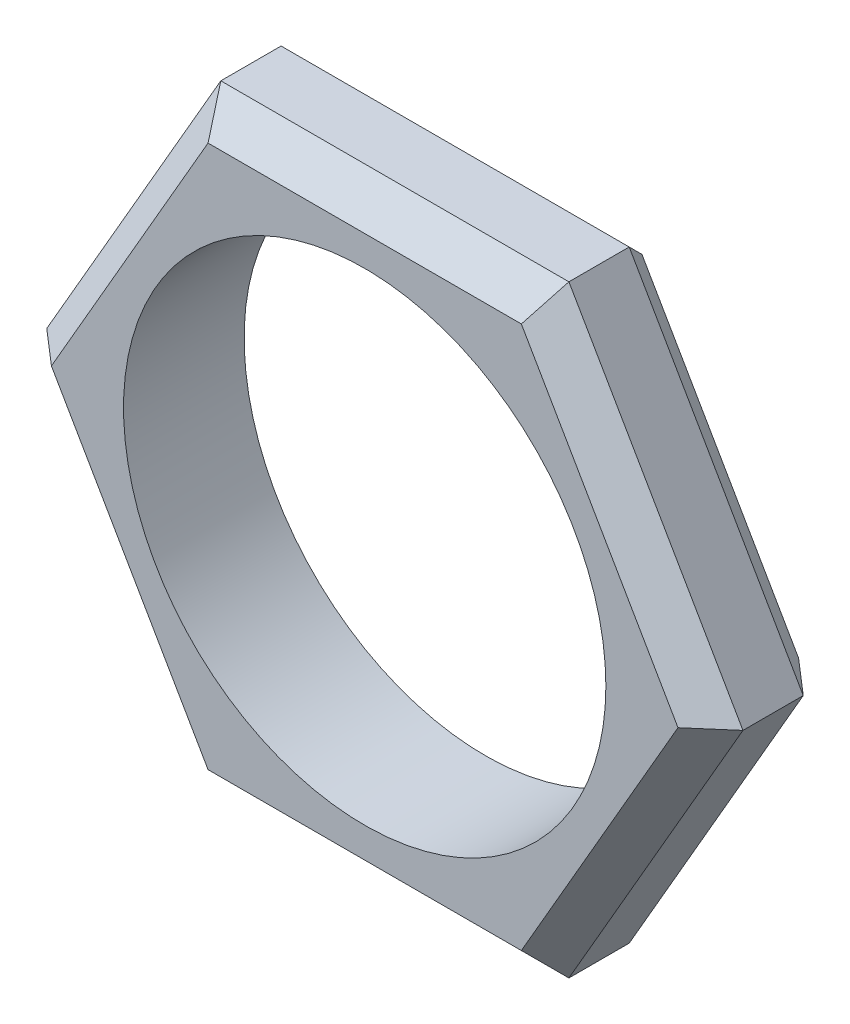
ISO-10303-21;
HEADER;
FILE_DESCRIPTION(('STEP AP214'),'2;1');
FILE_NAME('part.step','',(''),(''),'','','');
FILE_SCHEMA(('AUTOMOTIVE_DESIGN { 1 0 10303 214 1 1 1 1 }'));
ENDSEC;
DATA;
#1=APPLICATION_CONTEXT('core data for automotive mechanical design processes');
#2=APPLICATION_PROTOCOL_DEFINITION('international standard','automotive_design',2000,#1);
#3=PRODUCT_CONTEXT('',#1,'mechanical');
#4=PRODUCT('Part','Part','',(#3));
#5=PRODUCT_RELATED_PRODUCT_CATEGORY('part','',(#4));
#6=PRODUCT_DEFINITION_FORMATION('','',#4);
#7=PRODUCT_DEFINITION_CONTEXT('part definition',#1,'design');
#8=PRODUCT_DEFINITION('design','',#6,#7);
#9=PRODUCT_DEFINITION_SHAPE('','',#8);
#10=(LENGTH_UNIT() NAMED_UNIT(*) SI_UNIT(.MILLI.,.METRE.));
#11=(NAMED_UNIT(*) PLANE_ANGLE_UNIT() SI_UNIT($,.RADIAN.));
#12=(NAMED_UNIT(*) SI_UNIT($,.STERADIAN.) SOLID_ANGLE_UNIT());
#13=UNCERTAINTY_MEASURE_WITH_UNIT(LENGTH_MEASURE(1.E-05),#10,'distance_accuracy_value','');
#14=(GEOMETRIC_REPRESENTATION_CONTEXT(3) GLOBAL_UNCERTAINTY_ASSIGNED_CONTEXT((#13)) GLOBAL_UNIT_ASSIGNED_CONTEXT((#10,
#11,#12)) REPRESENTATION_CONTEXT('',''));
#15=CARTESIAN_POINT('',(0.,0.,0.));
#16=DIRECTION('',(0.,0.,1.));
#17=DIRECTION('',(1.,0.,0.));
#18=AXIS2_PLACEMENT_3D('',#15,#16,#17);
#19=CARTESIAN_POINT('',(0.,0.,2.));
#20=DIRECTION('',(0.,0.,1.));
#21=DIRECTION('',(1.,0.,0.));
#22=AXIS2_PLACEMENT_3D('',#19,#20,#21);
#23=PLANE('',#22);
#24=DIRECTION('',(-0.5,-0.866025403784439,0.));
#25=VECTOR('',#24,1.);
#26=CARTESIAN_POINT('',(-5.34048999000404,-0.250000000000001,2.));
#27=LINE('',#26,#25);
#28=CARTESIAN_POINT('',(-2.59807621135332,4.5,2.));
#29=VERTEX_POINT('',#28);
#30=CARTESIAN_POINT('',(-5.19615242270663,0.,2.));
#31=VERTEX_POINT('',#30);
#32=EDGE_CURVE('E191',#29,#31,#27,.T.);
#33=ORIENTED_EDGE('',*,*,#32,.T.);
#34=DIRECTION('',(0.5,-0.866025403784439,0.));
#35=VECTOR('',#34,1.);
#36=CARTESIAN_POINT('',(-2.45373864405591,-4.75,2.));
#37=LINE('',#36,#35);
#38=CARTESIAN_POINT('',(-2.59807621135331,-4.5,2.));
#39=VERTEX_POINT('',#38);
#40=EDGE_CURVE('E11',#31,#39,#37,.T.);
#41=ORIENTED_EDGE('',*,*,#40,.T.);
#42=DIRECTION('',(1.,0.,0.));
#43=VECTOR('',#42,1.);
#44=CARTESIAN_POINT('',(2.88675134594813,-4.5,2.));
#45=LINE('',#44,#43);
#46=CARTESIAN_POINT('',(2.59807621135332,-4.5,2.));
#47=VERTEX_POINT('',#46);
#48=EDGE_CURVE('E41',#39,#47,#45,.T.);
#49=ORIENTED_EDGE('',*,*,#48,.T.);
#50=DIRECTION('',(0.5,0.866025403784439,0.));
#51=VECTOR('',#50,1.);
#52=CARTESIAN_POINT('',(5.34048999000404,0.25,2.));
#53=LINE('',#52,#51);
#54=CARTESIAN_POINT('',(5.19615242270663,0.,2.));
#55=VERTEX_POINT('',#54);
#56=EDGE_CURVE('E186',#47,#55,#53,.T.);
#57=ORIENTED_EDGE('',*,*,#56,.T.);
#58=DIRECTION('',(-0.5,0.866025403784439,0.));
#59=VECTOR('',#58,1.);
#60=CARTESIAN_POINT('',(2.45373864405591,4.75,2.));
#61=LINE('',#60,#59);
#62=CARTESIAN_POINT('',(2.59807621135332,4.5,2.));
#63=VERTEX_POINT('',#62);
#64=EDGE_CURVE('E188',#55,#63,#61,.T.);
#65=ORIENTED_EDGE('',*,*,#64,.T.);
#66=DIRECTION('',(-1.,0.,0.));
#67=VECTOR('',#66,1.);
#68=CARTESIAN_POINT('',(-2.88675134594813,4.5,2.));
#69=LINE('',#68,#67);
#70=EDGE_CURVE('E157',#63,#29,#69,.T.);
#71=ORIENTED_EDGE('',*,*,#70,.T.);
#72=EDGE_LOOP('',(#33,#41,#49,#57,#65,#71));
#73=FACE_BOUND('',#72,.T.);
#74=CARTESIAN_POINT('',(0.,0.,2.));
#75=DIRECTION('',(0.,0.,1.));
#76=DIRECTION('',(1.,0.,0.));
#77=AXIS2_PLACEMENT_3D('',#74,#75,#76);
#78=CIRCLE('',#77,4.);
#79=CARTESIAN_POINT('',(4.,0.,2.));
#80=VERTEX_POINT('',#79);
#81=EDGE_CURVE('E236',#80,#80,#78,.T.);
#82=ORIENTED_EDGE('',*,*,#81,.F.);
#83=EDGE_LOOP('',(#82));
#84=FACE_BOUND('',#83,.T.);
#85=ADVANCED_FACE('F32',(#73,#84),#23,.T.);
#86=CARTESIAN_POINT('',(0.,0.,0.));
#87=DIRECTION('',(0.,0.,1.));
#88=DIRECTION('',(1.,0.,0.));
#89=AXIS2_PLACEMENT_3D('',#86,#87,#88);
#90=PLANE('',#89);
#91=DIRECTION('',(1.,0.,0.));
#92=VECTOR('',#91,1.);
#93=CARTESIAN_POINT('',(0.,4.5,0.));
#94=LINE('',#93,#92);
#95=CARTESIAN_POINT('',(-2.59807621135332,4.5,0.));
#96=VERTEX_POINT('',#95);
#97=CARTESIAN_POINT('',(2.59807621135331,4.5,0.));
#98=VERTEX_POINT('',#97);
#99=EDGE_CURVE('E213',#96,#98,#94,.T.);
#100=ORIENTED_EDGE('',*,*,#99,.T.);
#101=DIRECTION('',(0.5,-0.866025403784439,0.));
#102=VECTOR('',#101,1.);
#103=CARTESIAN_POINT('',(3.89711431702997,2.25,0.));
#104=LINE('',#103,#102);
#105=CARTESIAN_POINT('',(5.19615242270663,0.,0.));
#106=VERTEX_POINT('',#105);
#107=EDGE_CURVE('E135',#98,#106,#104,.T.);
#108=ORIENTED_EDGE('',*,*,#107,.T.);
#109=DIRECTION('',(-0.5,-0.866025403784439,0.));
#110=VECTOR('',#109,1.);
#111=CARTESIAN_POINT('',(3.89711431702997,-2.25,0.));
#112=LINE('',#111,#110);
#113=CARTESIAN_POINT('',(2.59807621135332,-4.5,0.));
#114=VERTEX_POINT('',#113);
#115=EDGE_CURVE('E221',#106,#114,#112,.T.);
#116=ORIENTED_EDGE('',*,*,#115,.T.);
#117=DIRECTION('',(-1.,0.,0.));
#118=VECTOR('',#117,1.);
#119=CARTESIAN_POINT('',(0.,-4.5,0.));
#120=LINE('',#119,#118);
#121=CARTESIAN_POINT('',(-2.59807621135331,-4.5,0.));
#122=VERTEX_POINT('',#121);
#123=EDGE_CURVE('E219',#114,#122,#120,.T.);
#124=ORIENTED_EDGE('',*,*,#123,.T.);
#125=DIRECTION('',(-0.5,0.866025403784439,0.));
#126=VECTOR('',#125,1.);
#127=CARTESIAN_POINT('',(-3.89711431702997,-2.25,0.));
#128=LINE('',#127,#126);
#129=CARTESIAN_POINT('',(-5.19615242270663,0.,0.));
#130=VERTEX_POINT('',#129);
#131=EDGE_CURVE('E217',#122,#130,#128,.T.);
#132=ORIENTED_EDGE('',*,*,#131,.T.);
#133=DIRECTION('',(0.5,0.866025403784439,0.));
#134=VECTOR('',#133,1.);
#135=CARTESIAN_POINT('',(-3.89711431702997,2.25,0.));
#136=LINE('',#135,#134);
#137=EDGE_CURVE('E215',#130,#96,#136,.T.);
#138=ORIENTED_EDGE('',*,*,#137,.T.);
#139=EDGE_LOOP('',(#100,#108,#116,#124,#132,#138));
#140=FACE_BOUND('',#139,.T.);
#141=CARTESIAN_POINT('',(0.,0.,0.));
#142=DIRECTION('',(0.,0.,1.));
#143=DIRECTION('',(1.,0.,0.));
#144=AXIS2_PLACEMENT_3D('',#141,#142,#143);
#145=CIRCLE('',#144,4.);
#146=CARTESIAN_POINT('',(4.,0.,0.));
#147=VERTEX_POINT('',#146);
#148=EDGE_CURVE('E174',#147,#147,#145,.T.);
#149=ORIENTED_EDGE('',*,*,#148,.T.);
#150=EDGE_LOOP('',(#149));
#151=FACE_BOUND('',#150,.T.);
#152=ADVANCED_FACE('F246',(#140,#151),#90,.F.);
#153=CARTESIAN_POINT('',(5.77350269189626,0.,2.));
#154=DIRECTION('',(-0.866025403784439,-0.5,0.));
#155=DIRECTION('',(0.5,-0.866025403784439,0.));
#156=AXIS2_PLACEMENT_3D('',#153,#154,#155);
#157=PLANE('',#156);
#158=DIRECTION('',(0.,0.,-1.));
#159=VECTOR('',#158,1.);
#160=CARTESIAN_POINT('',(5.77350269189626,0.,2.));
#161=LINE('',#160,#159);
#162=CARTESIAN_POINT('',(5.77350269189626,0.,1.5));
#163=VERTEX_POINT('',#162);
#164=CARTESIAN_POINT('',(5.77350269189626,0.,0.5));
#165=VERTEX_POINT('',#164);
#166=EDGE_CURVE('E234',#163,#165,#161,.T.);
#167=ORIENTED_EDGE('',*,*,#166,.T.);
#168=DIRECTION('',(-0.5,0.866025403784439,0.));
#169=VECTOR('',#168,1.);
#170=CARTESIAN_POINT('',(5.77350269189626,0.,0.5));
#171=LINE('',#170,#169);
#172=CARTESIAN_POINT('',(2.88675134594813,5.,0.5));
#173=VERTEX_POINT('',#172);
#174=EDGE_CURVE('E145',#165,#173,#171,.T.);
#175=ORIENTED_EDGE('',*,*,#174,.T.);
#176=DIRECTION('',(0.,0.,-1.));
#177=VECTOR('',#176,1.);
#178=CARTESIAN_POINT('',(2.88675134594813,5.,2.));
#179=LINE('',#178,#177);
#180=CARTESIAN_POINT('',(2.88675134594813,5.,1.5));
#181=VERTEX_POINT('',#180);
#182=EDGE_CURVE('E127',#181,#173,#179,.T.);
#183=ORIENTED_EDGE('',*,*,#182,.F.);
#184=DIRECTION('',(0.5,-0.866025403784439,0.));
#185=VECTOR('',#184,1.);
#186=CARTESIAN_POINT('',(5.77350269189626,0.,1.5));
#187=LINE('',#186,#185);
#188=EDGE_CURVE('E142',#181,#163,#187,.T.);
#189=ORIENTED_EDGE('',*,*,#188,.T.);
#190=EDGE_LOOP('',(#167,#175,#183,#189));
#191=FACE_BOUND('',#190,.T.);
#192=ADVANCED_FACE('F141',(#191),#157,.F.);
#193=CARTESIAN_POINT('',(2.88675134594813,5.,2.));
#194=DIRECTION('',(0.,-1.,0.));
#195=DIRECTION('',(0.,0.,-1.));
#196=AXIS2_PLACEMENT_3D('',#193,#194,#195);
#197=PLANE('',#196);
#198=ORIENTED_EDGE('',*,*,#182,.T.);
#199=DIRECTION('',(-1.,0.,0.));
#200=VECTOR('',#199,1.);
#201=CARTESIAN_POINT('',(2.88675134594813,5.,0.5));
#202=LINE('',#201,#200);
#203=CARTESIAN_POINT('',(-2.88675134594813,5.,0.500000000000001));
#204=VERTEX_POINT('',#203);
#205=EDGE_CURVE('E134',#173,#204,#202,.T.);
#206=ORIENTED_EDGE('',*,*,#205,.T.);
#207=DIRECTION('',(0.,0.,-1.));
#208=VECTOR('',#207,1.);
#209=CARTESIAN_POINT('',(-2.88675134594813,5.,2.));
#210=LINE('',#209,#208);
#211=CARTESIAN_POINT('',(-2.88675134594813,5.,1.5));
#212=VERTEX_POINT('',#211);
#213=EDGE_CURVE('E129',#212,#204,#210,.T.);
#214=ORIENTED_EDGE('',*,*,#213,.F.);
#215=DIRECTION('',(1.,0.,0.));
#216=VECTOR('',#215,1.);
#217=CARTESIAN_POINT('',(2.88675134594813,5.,1.5));
#218=LINE('',#217,#216);
#219=EDGE_CURVE('E124',#212,#181,#218,.T.);
#220=ORIENTED_EDGE('',*,*,#219,.T.);
#221=EDGE_LOOP('',(#198,#206,#214,#220));
#222=FACE_BOUND('',#221,.T.);
#223=ADVANCED_FACE('F126',(#222),#197,.F.);
#224=CARTESIAN_POINT('',(-2.88675134594813,5.,2.));
#225=DIRECTION('',(0.866025403784439,-0.5,0.));
#226=DIRECTION('',(0.5,0.866025403784439,0.));
#227=AXIS2_PLACEMENT_3D('',#224,#225,#226);
#228=PLANE('',#227);
#229=ORIENTED_EDGE('',*,*,#213,.T.);
#230=DIRECTION('',(-0.5,-0.866025403784439,0.));
#231=VECTOR('',#230,1.);
#232=CARTESIAN_POINT('',(-2.88675134594813,5.,0.500000000000001));
#233=LINE('',#232,#231);
#234=CARTESIAN_POINT('',(-5.77350269189626,0.,0.5));
#235=VERTEX_POINT('',#234);
#236=EDGE_CURVE('E206',#204,#235,#233,.T.);
#237=ORIENTED_EDGE('',*,*,#236,.T.);
#238=DIRECTION('',(0.,0.,-1.));
#239=VECTOR('',#238,1.);
#240=CARTESIAN_POINT('',(-5.77350269189626,0.,2.));
#241=LINE('',#240,#239);
#242=CARTESIAN_POINT('',(-5.77350269189626,0.,1.5));
#243=VERTEX_POINT('',#242);
#244=EDGE_CURVE('E225',#243,#235,#241,.T.);
#245=ORIENTED_EDGE('',*,*,#244,.F.);
#246=DIRECTION('',(0.5,0.866025403784439,0.));
#247=VECTOR('',#246,1.);
#248=CARTESIAN_POINT('',(-2.88675134594813,5.,1.5));
#249=LINE('',#248,#247);
#250=EDGE_CURVE('E208',#243,#212,#249,.T.);
#251=ORIENTED_EDGE('',*,*,#250,.T.);
#252=EDGE_LOOP('',(#229,#237,#245,#251));
#253=FACE_BOUND('',#252,.T.);
#254=ADVANCED_FACE('F266',(#253),#228,.F.);
#255=CARTESIAN_POINT('',(-5.77350269189626,0.,2.));
#256=DIRECTION('',(0.866025403784439,0.5,0.));
#257=DIRECTION('',(-0.5,0.866025403784438,0.));
#258=AXIS2_PLACEMENT_3D('',#255,#256,#257);
#259=PLANE('',#258);
#260=ORIENTED_EDGE('',*,*,#244,.T.);
#261=DIRECTION('',(0.5,-0.866025403784438,0.));
#262=VECTOR('',#261,1.);
#263=CARTESIAN_POINT('',(-5.77350269189626,0.,0.5));
#264=LINE('',#263,#262);
#265=CARTESIAN_POINT('',(-2.88675134594813,-5.,0.5));
#266=VERTEX_POINT('',#265);
#267=EDGE_CURVE('E201',#235,#266,#264,.T.);
#268=ORIENTED_EDGE('',*,*,#267,.T.);
#269=DIRECTION('',(0.,0.,-1.));
#270=VECTOR('',#269,1.);
#271=CARTESIAN_POINT('',(-2.88675134594813,-5.,2.));
#272=LINE('',#271,#270);
#273=CARTESIAN_POINT('',(-2.88675134594813,-5.,1.5));
#274=VERTEX_POINT('',#273);
#275=EDGE_CURVE('E228',#274,#266,#272,.T.);
#276=ORIENTED_EDGE('',*,*,#275,.F.);
#277=DIRECTION('',(-0.5,0.866025403784438,0.));
#278=VECTOR('',#277,1.);
#279=CARTESIAN_POINT('',(-5.77350269189626,0.,1.5));
#280=LINE('',#279,#278);
#281=EDGE_CURVE('E203',#274,#243,#280,.T.);
#282=ORIENTED_EDGE('',*,*,#281,.T.);
#283=EDGE_LOOP('',(#260,#268,#276,#282));
#284=FACE_BOUND('',#283,.T.);
#285=ADVANCED_FACE('F262',(#284),#259,.F.);
#286=CARTESIAN_POINT('',(-2.88675134594813,-5.,2.));
#287=DIRECTION('',(0.,1.,0.));
#288=DIRECTION('',(-1.,0.,0.));
#289=AXIS2_PLACEMENT_3D('',#286,#287,#288);
#290=PLANE('',#289);
#291=ORIENTED_EDGE('',*,*,#275,.T.);
#292=DIRECTION('',(1.,0.,0.));
#293=VECTOR('',#292,1.);
#294=CARTESIAN_POINT('',(-2.88675134594813,-5.,0.5));
#295=LINE('',#294,#293);
#296=CARTESIAN_POINT('',(2.88675134594813,-5.,0.5));
#297=VERTEX_POINT('',#296);
#298=EDGE_CURVE('E197',#266,#297,#295,.T.);
#299=ORIENTED_EDGE('',*,*,#298,.T.);
#300=DIRECTION('',(0.,0.,-1.));
#301=VECTOR('',#300,1.);
#302=CARTESIAN_POINT('',(2.88675134594813,-5.,2.));
#303=LINE('',#302,#301);
#304=CARTESIAN_POINT('',(2.88675134594813,-5.,1.5));
#305=VERTEX_POINT('',#304);
#306=EDGE_CURVE('E231',#305,#297,#303,.T.);
#307=ORIENTED_EDGE('',*,*,#306,.F.);
#308=DIRECTION('',(-1.,0.,0.));
#309=VECTOR('',#308,1.);
#310=CARTESIAN_POINT('',(-2.88675134594813,-5.,1.5));
#311=LINE('',#310,#309);
#312=EDGE_CURVE('E199',#305,#274,#311,.T.);
#313=ORIENTED_EDGE('',*,*,#312,.T.);
#314=EDGE_LOOP('',(#291,#299,#307,#313));
#315=FACE_BOUND('',#314,.T.);
#316=ADVANCED_FACE('F258',(#315),#290,.F.);
#317=CARTESIAN_POINT('',(2.88675134594813,-5.,2.));
#318=DIRECTION('',(-0.866025403784439,0.5,0.));
#319=DIRECTION('',(-0.5,-0.866025403784439,0.));
#320=AXIS2_PLACEMENT_3D('',#317,#318,#319);
#321=PLANE('',#320);
#322=ORIENTED_EDGE('',*,*,#306,.T.);
#323=DIRECTION('',(0.5,0.866025403784439,0.));
#324=VECTOR('',#323,1.);
#325=CARTESIAN_POINT('',(2.88675134594813,-5.,0.5));
#326=LINE('',#325,#324);
#327=EDGE_CURVE('E193',#297,#165,#326,.T.);
#328=ORIENTED_EDGE('',*,*,#327,.T.);
#329=ORIENTED_EDGE('',*,*,#166,.F.);
#330=DIRECTION('',(-0.5,-0.866025403784439,0.));
#331=VECTOR('',#330,1.);
#332=CARTESIAN_POINT('',(2.88675134594813,-5.,1.5));
#333=LINE('',#332,#331);
#334=EDGE_CURVE('E195',#163,#305,#333,.T.);
#335=ORIENTED_EDGE('',*,*,#334,.T.);
#336=EDGE_LOOP('',(#322,#328,#329,#335));
#337=FACE_BOUND('',#336,.T.);
#338=ADVANCED_FACE('F255',(#337),#321,.F.);
#339=CARTESIAN_POINT('',(0.,0.,2.));
#340=DIRECTION('',(0.,0.,-1.));
#341=DIRECTION('',(-1.,0.,0.));
#342=AXIS2_PLACEMENT_3D('',#339,#340,#341);
#343=CYLINDRICAL_SURFACE('',#342,4.);
#344=ORIENTED_EDGE('',*,*,#81,.T.);
#345=EDGE_LOOP('',(#344));
#346=FACE_BOUND('',#345,.T.);
#347=ORIENTED_EDGE('',*,*,#148,.F.);
#348=EDGE_LOOP('',(#347));
#349=FACE_BOUND('',#348,.T.);
#350=ADVANCED_FACE('F242',(#346,#349),#343,.F.);
#351=CARTESIAN_POINT('',(-5.77350269189626,0.,0.5));
#352=DIRECTION('',(0.612372435695794,0.353553390593273,0.707106781186549));
#353=DIRECTION('',(0.5,-0.866025403784438,0.));
#354=AXIS2_PLACEMENT_3D('',#351,#352,#353);
#355=PLANE('',#354);
#356=DIRECTION('',(0.755928946018455,0.,-0.654653670707976));
#357=VECTOR('',#356,1.);
#358=CARTESIAN_POINT('',(-5.77350269189626,0.,0.5));
#359=LINE('',#358,#357);
#360=EDGE_CURVE('E175',#130,#235,#359,.F.);
#361=ORIENTED_EDGE('',*,*,#360,.F.);
#362=ORIENTED_EDGE('',*,*,#131,.F.);
#363=DIRECTION('',(0.377964473009227,0.654653670707979,-0.654653670707976));
#364=VECTOR('',#363,1.);
#365=CARTESIAN_POINT('',(-2.88675134594813,-5.,0.5));
#366=LINE('',#365,#364);
#367=EDGE_CURVE('E171',#266,#122,#366,.T.);
#368=ORIENTED_EDGE('',*,*,#367,.F.);
#369=ORIENTED_EDGE('',*,*,#267,.F.);
#370=EDGE_LOOP('',(#361,#362,#368,#369));
#371=FACE_BOUND('',#370,.T.);
#372=ADVANCED_FACE('F294',(#371),#355,.F.);
#373=CARTESIAN_POINT('',(-2.88675134594813,-5.,0.5));
#374=DIRECTION('',(0.,0.707106781186546,0.707106781186549));
#375=DIRECTION('',(1.,0.,0.));
#376=AXIS2_PLACEMENT_3D('',#373,#374,#375);
#377=PLANE('',#376);
#378=ORIENTED_EDGE('',*,*,#367,.T.);
#379=ORIENTED_EDGE('',*,*,#123,.F.);
#380=DIRECTION('',(-0.377964473009228,0.654653670707978,-0.654653670707976));
#381=VECTOR('',#380,1.);
#382=CARTESIAN_POINT('',(2.88675134594813,-5.,0.5));
#383=LINE('',#382,#381);
#384=EDGE_CURVE('E178',#297,#114,#383,.T.);
#385=ORIENTED_EDGE('',*,*,#384,.F.);
#386=ORIENTED_EDGE('',*,*,#298,.F.);
#387=EDGE_LOOP('',(#378,#379,#385,#386));
#388=FACE_BOUND('',#387,.T.);
#389=ADVANCED_FACE('F290',(#388),#377,.F.);
#390=CARTESIAN_POINT('',(-2.88675134594813,5.,0.5));
#391=DIRECTION('',(0.612372435695794,-0.353553390593273,0.707106781186549));
#392=DIRECTION('',(-0.5,-0.866025403784439,0.));
#393=AXIS2_PLACEMENT_3D('',#390,#391,#392);
#394=PLANE('',#393);
#395=ORIENTED_EDGE('',*,*,#360,.T.);
#396=ORIENTED_EDGE('',*,*,#236,.F.);
#397=DIRECTION('',(0.377964473009227,-0.654653670707978,-0.654653670707976));
#398=VECTOR('',#397,1.);
#399=CARTESIAN_POINT('',(-2.88675134594813,5.,0.5));
#400=LINE('',#399,#398);
#401=EDGE_CURVE('E181',#96,#204,#400,.F.);
#402=ORIENTED_EDGE('',*,*,#401,.F.);
#403=ORIENTED_EDGE('',*,*,#137,.F.);
#404=EDGE_LOOP('',(#395,#396,#402,#403));
#405=FACE_BOUND('',#404,.T.);
#406=ADVANCED_FACE('F286',(#405),#394,.F.);
#407=CARTESIAN_POINT('',(2.88675134594813,-5.,0.5));
#408=DIRECTION('',(-0.612372435695793,0.353553390593273,0.707106781186549));
#409=DIRECTION('',(0.5,0.866025403784439,0.));
#410=AXIS2_PLACEMENT_3D('',#407,#408,#409);
#411=PLANE('',#410);
#412=ORIENTED_EDGE('',*,*,#384,.T.);
#413=ORIENTED_EDGE('',*,*,#115,.F.);
#414=DIRECTION('',(0.755928946018455,0.,0.654653670707976));
#415=VECTOR('',#414,1.);
#416=CARTESIAN_POINT('',(4.12393049421161,0.,-0.928571428571425));
#417=LINE('',#416,#415);
#418=EDGE_CURVE('E159',#165,#106,#417,.F.);
#419=ORIENTED_EDGE('',*,*,#418,.F.);
#420=ORIENTED_EDGE('',*,*,#327,.F.);
#421=EDGE_LOOP('',(#412,#413,#419,#420));
#422=FACE_BOUND('',#421,.T.);
#423=ADVANCED_FACE('F282',(#422),#411,.F.);
#424=CARTESIAN_POINT('',(2.88675134594813,5.,0.5));
#425=DIRECTION('',(0.,-0.707106781186546,0.707106781186549));
#426=DIRECTION('',(-1.,0.,0.));
#427=AXIS2_PLACEMENT_3D('',#424,#425,#426);
#428=PLANE('',#427);
#429=ORIENTED_EDGE('',*,*,#401,.T.);
#430=ORIENTED_EDGE('',*,*,#205,.F.);
#431=DIRECTION('',(-0.377964473009227,-0.654653670707978,-0.654653670707976));
#432=VECTOR('',#431,1.);
#433=CARTESIAN_POINT('',(2.88675134594813,5.,0.5));
#434=LINE('',#433,#432);
#435=EDGE_CURVE('E158',#98,#173,#434,.F.);
#436=ORIENTED_EDGE('',*,*,#435,.F.);
#437=ORIENTED_EDGE('',*,*,#99,.F.);
#438=EDGE_LOOP('',(#429,#430,#436,#437));
#439=FACE_BOUND('',#438,.T.);
#440=ADVANCED_FACE('F278',(#439),#428,.F.);
#441=CARTESIAN_POINT('',(5.77350269189626,0.,0.5));
#442=DIRECTION('',(-0.612372435695794,-0.353553390593273,0.707106781186549));
#443=DIRECTION('',(-0.5,0.866025403784439,0.));
#444=AXIS2_PLACEMENT_3D('',#441,#442,#443);
#445=PLANE('',#444);
#446=ORIENTED_EDGE('',*,*,#418,.T.);
#447=ORIENTED_EDGE('',*,*,#107,.F.);
#448=ORIENTED_EDGE('',*,*,#435,.T.);
#449=ORIENTED_EDGE('',*,*,#174,.F.);
#450=EDGE_LOOP('',(#446,#447,#448,#449));
#451=FACE_BOUND('',#450,.T.);
#452=ADVANCED_FACE('F275',(#451),#445,.F.);
#453=CARTESIAN_POINT('',(3.89711431702997,2.25,2.));
#454=DIRECTION('',(0.612372435695794,0.353553390593274,0.707106781186547));
#455=DIRECTION('',(0.5,-0.866025403784439,0.));
#456=AXIS2_PLACEMENT_3D('',#453,#454,#455);
#457=PLANE('',#456);
#458=DIRECTION('',(0.755928946018454,0.,-0.654653670707977));
#459=VECTOR('',#458,1.);
#460=CARTESIAN_POINT('',(4.45384493374854,0.,2.64285714285714));
#461=LINE('',#460,#459);
#462=EDGE_CURVE('E153',#163,#55,#461,.F.);
#463=ORIENTED_EDGE('',*,*,#462,.F.);
#464=ORIENTED_EDGE('',*,*,#188,.F.);
#465=DIRECTION('',(0.377964473009227,0.654653670707977,-0.654653670707977));
#466=VECTOR('',#465,1.);
#467=CARTESIAN_POINT('',(2.22692246687427,3.85714285714286,2.64285714285714));
#468=LINE('',#467,#466);
#469=EDGE_CURVE('E36',#63,#181,#468,.T.);
#470=ORIENTED_EDGE('',*,*,#469,.F.);
#471=ORIENTED_EDGE('',*,*,#64,.F.);
#472=EDGE_LOOP('',(#463,#464,#470,#471));
#473=FACE_BOUND('',#472,.T.);
#474=ADVANCED_FACE('F34',(#473),#457,.T.);
#475=CARTESIAN_POINT('',(0.,4.5,2.));
#476=DIRECTION('',(0.,0.707106781186547,0.707106781186547));
#477=DIRECTION('',(1.,0.,0.));
#478=AXIS2_PLACEMENT_3D('',#475,#476,#477);
#479=PLANE('',#478);
#480=ORIENTED_EDGE('',*,*,#469,.T.);
#481=ORIENTED_EDGE('',*,*,#219,.F.);
#482=DIRECTION('',(-0.377964473009226,0.654653670707977,-0.654653670707977));
#483=VECTOR('',#482,1.);
#484=CARTESIAN_POINT('',(-2.22692246687427,3.85714285714285,2.64285714285714));
#485=LINE('',#484,#483);
#486=EDGE_CURVE('E161',#29,#212,#485,.T.);
#487=ORIENTED_EDGE('',*,*,#486,.F.);
#488=ORIENTED_EDGE('',*,*,#70,.F.);
#489=EDGE_LOOP('',(#480,#481,#487,#488));
#490=FACE_BOUND('',#489,.T.);
#491=ADVANCED_FACE('F156',(#490),#479,.T.);
#492=CARTESIAN_POINT('',(3.89711431702998,-2.25,2.));
#493=DIRECTION('',(0.612372435695795,-0.353553390593274,0.707106781186547));
#494=DIRECTION('',(-0.5,-0.866025403784439,0.));
#495=AXIS2_PLACEMENT_3D('',#492,#493,#494);
#496=PLANE('',#495);
#497=ORIENTED_EDGE('',*,*,#462,.T.);
#498=ORIENTED_EDGE('',*,*,#56,.F.);
#499=DIRECTION('',(0.377964473009226,-0.654653670707978,-0.654653670707977));
#500=VECTOR('',#499,1.);
#501=CARTESIAN_POINT('',(2.22692246687427,-3.85714285714285,2.64285714285714));
#502=LINE('',#501,#500);
#503=EDGE_CURVE('E163',#305,#47,#502,.F.);
#504=ORIENTED_EDGE('',*,*,#503,.F.);
#505=ORIENTED_EDGE('',*,*,#334,.F.);
#506=EDGE_LOOP('',(#497,#498,#504,#505));
#507=FACE_BOUND('',#506,.T.);
#508=ADVANCED_FACE('F309',(#507),#496,.T.);
#509=CARTESIAN_POINT('',(-3.89711431702997,2.25,2.));
#510=DIRECTION('',(-0.612372435695795,0.353553390593274,0.707106781186547));
#511=DIRECTION('',(0.5,0.866025403784439,0.));
#512=AXIS2_PLACEMENT_3D('',#509,#510,#511);
#513=PLANE('',#512);
#514=ORIENTED_EDGE('',*,*,#486,.T.);
#515=ORIENTED_EDGE('',*,*,#250,.F.);
#516=DIRECTION('',(0.755928946018454,0.,0.654653670707977));
#517=VECTOR('',#516,1.);
#518=CARTESIAN_POINT('',(-4.45384493374854,0.,2.64285714285714));
#519=LINE('',#518,#517);
#520=EDGE_CURVE('E168',#31,#243,#519,.F.);
#521=ORIENTED_EDGE('',*,*,#520,.F.);
#522=ORIENTED_EDGE('',*,*,#32,.F.);
#523=EDGE_LOOP('',(#514,#515,#521,#522));
#524=FACE_BOUND('',#523,.T.);
#525=ADVANCED_FACE('F305',(#524),#513,.T.);
#526=CARTESIAN_POINT('',(0.,-4.5,2.));
#527=DIRECTION('',(0.,-0.707106781186547,0.707106781186548));
#528=DIRECTION('',(-1.,0.,0.));
#529=AXIS2_PLACEMENT_3D('',#526,#527,#528);
#530=PLANE('',#529);
#531=ORIENTED_EDGE('',*,*,#503,.T.);
#532=ORIENTED_EDGE('',*,*,#48,.F.);
#533=DIRECTION('',(-0.377964473009227,-0.654653670707978,-0.654653670707977));
#534=VECTOR('',#533,1.);
#535=CARTESIAN_POINT('',(-2.22692246687427,-3.85714285714286,2.64285714285714));
#536=LINE('',#535,#534);
#537=EDGE_CURVE('E49',#274,#39,#536,.F.);
#538=ORIENTED_EDGE('',*,*,#537,.F.);
#539=ORIENTED_EDGE('',*,*,#312,.F.);
#540=EDGE_LOOP('',(#531,#532,#538,#539));
#541=FACE_BOUND('',#540,.T.);
#542=ADVANCED_FACE('F302',(#541),#530,.T.);
#543=CARTESIAN_POINT('',(-3.89711431702997,-2.25,2.));
#544=DIRECTION('',(-0.612372435695794,-0.353553390593274,0.707106781186548));
#545=DIRECTION('',(-0.5,0.866025403784438,0.));
#546=AXIS2_PLACEMENT_3D('',#543,#544,#545);
#547=PLANE('',#546);
#548=ORIENTED_EDGE('',*,*,#520,.T.);
#549=ORIENTED_EDGE('',*,*,#281,.F.);
#550=ORIENTED_EDGE('',*,*,#537,.T.);
#551=ORIENTED_EDGE('',*,*,#40,.F.);
#552=EDGE_LOOP('',(#548,#549,#550,#551));
#553=FACE_BOUND('',#552,.T.);
#554=ADVANCED_FACE('F299',(#553),#547,.T.);
#555=CLOSED_SHELL('',(#85,#152,#192,#223,#254,#285,#316,#338,#350,#372,#389,#406,#423,#440,#452,
#474,#491,#508,#525,#542,#554));
#556=MANIFOLD_SOLID_BREP('B2',#555);
#557=ADVANCED_BREP_SHAPE_REPRESENTATION('',(#18,#556),#14);
#558=SHAPE_DEFINITION_REPRESENTATION(#9,#557);
ENDSEC;
END-ISO-10303-21;
